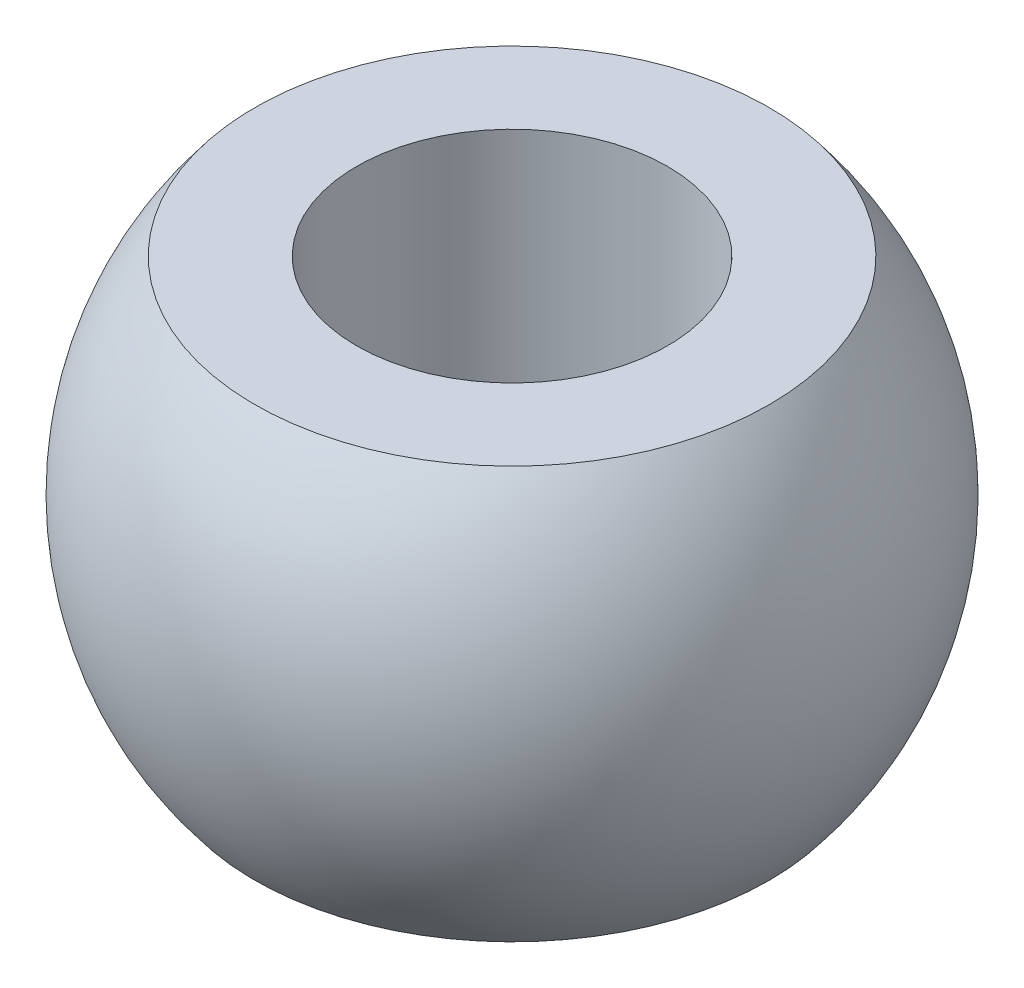
ISO-10303-21;
HEADER;
FILE_DESCRIPTION(('STEP AP214'),'2;1');
FILE_NAME('part.step','',(''),(''),'','','');
FILE_SCHEMA(('AUTOMOTIVE_DESIGN { 1 0 10303 214 1 1 1 1 }'));
ENDSEC;
DATA;
#1=APPLICATION_CONTEXT('core data for automotive mechanical design processes');
#2=APPLICATION_PROTOCOL_DEFINITION('international standard','automotive_design',2000,#1);
#3=PRODUCT_CONTEXT('',#1,'mechanical');
#4=PRODUCT('Part','Part','',(#3));
#5=PRODUCT_RELATED_PRODUCT_CATEGORY('part','',(#4));
#6=PRODUCT_DEFINITION_FORMATION('','',#4);
#7=PRODUCT_DEFINITION_CONTEXT('part definition',#1,'design');
#8=PRODUCT_DEFINITION('design','',#6,#7);
#9=PRODUCT_DEFINITION_SHAPE('','',#8);
#10=(LENGTH_UNIT() NAMED_UNIT(*) SI_UNIT(.MILLI.,.METRE.));
#11=(NAMED_UNIT(*) PLANE_ANGLE_UNIT() SI_UNIT($,.RADIAN.));
#12=(NAMED_UNIT(*) SI_UNIT($,.STERADIAN.) SOLID_ANGLE_UNIT());
#13=UNCERTAINTY_MEASURE_WITH_UNIT(LENGTH_MEASURE(1.E-05),#10,'distance_accuracy_value','');
#14=(GEOMETRIC_REPRESENTATION_CONTEXT(3) GLOBAL_UNCERTAINTY_ASSIGNED_CONTEXT((#13)) GLOBAL_UNIT_ASSIGNED_CONTEXT((#10,
#11,#12)) REPRESENTATION_CONTEXT('',''));
#15=CARTESIAN_POINT('',(0.,0.,0.));
#16=DIRECTION('',(0.,0.,1.));
#17=DIRECTION('',(1.,0.,0.));
#18=AXIS2_PLACEMENT_3D('',#15,#16,#17);
#19=CARTESIAN_POINT('',(5.,-6.625,0.));
#20=DIRECTION('',(0.,1.,0.));
#21=DIRECTION('',(0.,0.,1.));
#22=AXIS2_PLACEMENT_3D('',#19,#20,#21);
#23=PLANE('',#22);
#24=CARTESIAN_POINT('',(0.,-6.62500000000001,0.));
#25=DIRECTION('',(0.,1.,0.));
#26=DIRECTION('',(0.,0.,1.));
#27=AXIS2_PLACEMENT_3D('',#24,#25,#26);
#28=CIRCLE('',#27,8.27462234787788);
#29=CARTESIAN_POINT('',(8.27462234787788,-6.62500000000001,0.));
#30=VERTEX_POINT('',#29);
#31=EDGE_CURVE('E10',#30,#30,#28,.T.);
#32=ORIENTED_EDGE('',*,*,#31,.F.);
#33=EDGE_LOOP('',(#32));
#34=FACE_BOUND('',#33,.T.);
#35=CARTESIAN_POINT('',(0.,-6.625,0.));
#36=DIRECTION('',(0.,1.,0.));
#37=DIRECTION('',(0.,0.,1.));
#38=AXIS2_PLACEMENT_3D('',#35,#36,#37);
#39=CIRCLE('',#38,5.);
#40=CARTESIAN_POINT('',(0.,-6.625,5.));
#41=VERTEX_POINT('',#40);
#42=EDGE_CURVE('E46',#41,#41,#39,.T.);
#43=ORIENTED_EDGE('',*,*,#42,.T.);
#44=EDGE_LOOP('',(#43));
#45=FACE_BOUND('',#44,.T.);
#46=ADVANCED_FACE('F32',(#34,#45),#23,.F.);
#47=CARTESIAN_POINT('',(0.,0.,0.));
#48=DIRECTION('',(0.,1.,0.));
#49=DIRECTION('',(1.,0.,0.));
#50=AXIS2_PLACEMENT_3D('',#47,#48,#49);
#51=SPHERICAL_SURFACE('',#50,10.6);
#52=CARTESIAN_POINT('',(0.,6.625,0.));
#53=DIRECTION('',(0.,1.,0.));
#54=DIRECTION('',(0.,0.,1.));
#55=AXIS2_PLACEMENT_3D('',#52,#53,#54);
#56=CIRCLE('',#55,8.27462234787788);
#57=CARTESIAN_POINT('',(8.27462234787788,6.625,0.));
#58=VERTEX_POINT('',#57);
#59=EDGE_CURVE('E38',#58,#58,#56,.T.);
#60=CARTESIAN_POINT('',(8.27462234787788,6.625,0.));
#61=CARTESIAN_POINT('',(8.36780618467368,6.50861664026527,0.));
#62=CARTESIAN_POINT('',(8.45853138331952,6.39026498283566,0.));
#63=CARTESIAN_POINT('',(8.63491011465458,6.14984098782253,0.));
#64=CARTESIAN_POINT('',(8.7205636473438,6.02776865023899,0.));
#65=CARTESIAN_POINT('',(8.88664465710891,5.78011921015382,0.));
#66=CARTESIAN_POINT('',(8.9670721341848,5.65454210765217,0.));
#67=CARTESIAN_POINT('',(9.12255836578817,5.40010706699141,0.));
#68=CARTESIAN_POINT('',(9.19761712031565,5.27124912883229,0.));
#69=CARTESIAN_POINT('',(9.34223214913767,5.01048171115528,0.));
#70=CARTESIAN_POINT('',(9.41178842343221,4.87857223163741,0.));
#71=CARTESIAN_POINT('',(9.54527470339223,4.61193658536463,0.));
#72=CARTESIAN_POINT('',(9.60920470905771,4.47721041860973,0.));
#73=CARTESIAN_POINT('',(9.73132463278886,4.20518123214942,0.));
#74=CARTESIAN_POINT('',(9.78951455085454,4.06787821244402,0.));
#75=CARTESIAN_POINT('',(9.9000507114742,3.79093975086938,0.));
#76=CARTESIAN_POINT('',(9.95239695402819,3.65130430900014,0.));
#77=CARTESIAN_POINT('',(10.0511525753681,3.36994958364531,0.));
#78=CARTESIAN_POINT('',(10.0975619541541,3.22823030015973,0.));
#79=CARTESIAN_POINT('',(10.184361229489,2.94296018246203,0.));
#80=CARTESIAN_POINT('',(10.224751126038,2.79940934824991,0.));
#81=CARTESIAN_POINT('',(10.2994395341611,2.51073168036646,0.));
#82=CARTESIAN_POINT('',(10.3337380457351,2.36560484669513,0.));
#83=CARTESIAN_POINT('',(10.3961826252075,2.07403353682514,0.));
#84=CARTESIAN_POINT('',(10.4243286931058,1.92758906062647,0.));
#85=CARTESIAN_POINT('',(10.4744182791794,1.63364316830766,0.));
#86=CARTESIAN_POINT('',(10.4963617973547,1.4861417521875,0.));
#87=CARTESIAN_POINT('',(10.5340072198097,1.19034456421489,0.));
#88=CARTESIAN_POINT('',(10.5497091240895,1.04204879236243,0.));
#89=CARTESIAN_POINT('',(10.5748433659924,0.744926891237265,0.));
#90=CARTESIAN_POINT('',(10.5842757036156,0.596100761964553,0.));
#91=CARTESIAN_POINT('',(10.5968540206194,0.298183088461226,0.));
#92=CARTESIAN_POINT('',(10.6,0.149091544230611,0.));
#93=CARTESIAN_POINT('',(10.6,-0.149091544230618,0.));
#94=CARTESIAN_POINT('',(10.5968540206194,-0.298183088461233,0.));
#95=CARTESIAN_POINT('',(10.5842757036156,-0.59610076196456,0.));
#96=CARTESIAN_POINT('',(10.5748433659924,-0.744926891237273,0.));
#97=CARTESIAN_POINT('',(10.5497091240895,-1.04204879236244,0.));
#98=CARTESIAN_POINT('',(10.5340072198097,-1.19034456421489,0.));
#99=CARTESIAN_POINT('',(10.4963617973547,-1.48614175218751,0.));
#100=CARTESIAN_POINT('',(10.4744182791794,-1.63364316830766,0.));
#101=CARTESIAN_POINT('',(10.4243286931058,-1.92758906062648,0.));
#102=CARTESIAN_POINT('',(10.3961826252075,-2.07403353682514,0.));
#103=CARTESIAN_POINT('',(10.3337380457351,-2.36560484669513,0.));
#104=CARTESIAN_POINT('',(10.2994395341611,-2.51073168036646,0.));
#105=CARTESIAN_POINT('',(10.224751126038,-2.79940934824991,0.));
#106=CARTESIAN_POINT('',(10.184361229489,-2.94296018246203,0.));
#107=CARTESIAN_POINT('',(10.0975619541541,-3.22823030015974,0.));
#108=CARTESIAN_POINT('',(10.0511525753681,-3.36994958364532,0.));
#109=CARTESIAN_POINT('',(9.95239695402818,-3.65130430900015,0.));
#110=CARTESIAN_POINT('',(9.9000507114742,-3.79093975086939,0.));
#111=CARTESIAN_POINT('',(9.78951455085454,-4.06787821244403,0.));
#112=CARTESIAN_POINT('',(9.73132463278886,-4.20518123214943,0.));
#113=CARTESIAN_POINT('',(9.6092047090577,-4.47721041860973,0.));
#114=CARTESIAN_POINT('',(9.54527470339223,-4.61193658536463,0.));
#115=CARTESIAN_POINT('',(9.41178842343221,-4.87857223163741,0.));
#116=CARTESIAN_POINT('',(9.34223214913766,-5.01048171115529,0.));
#117=CARTESIAN_POINT('',(9.19761712031564,-5.27124912883229,0.));
#118=CARTESIAN_POINT('',(9.12255836578816,-5.40010706699141,0.));
#119=CARTESIAN_POINT('',(8.96707213418479,-5.65454210765218,0.));
#120=CARTESIAN_POINT('',(8.8866446571089,-5.78011921015382,0.));
#121=CARTESIAN_POINT('',(8.72056364734379,-6.027768650239,0.));
#122=CARTESIAN_POINT('',(8.63491011465458,-6.14984098782253,0.));
#123=CARTESIAN_POINT('',(8.45853138331952,-6.39026498283567,0.));
#124=CARTESIAN_POINT('',(8.36780618467368,-6.50861664026527,0.));
#125=CARTESIAN_POINT('',(8.27462234787788,-6.62500000000001,0.));
#126=B_SPLINE_CURVE_WITH_KNOTS('',3,(#60,#61,#62,#63,#64,#65,#66,#67,#68,#69,#70,#71,#72,#73,
#74,#75,#76,#77,#78,#79,#80,#81,#82,#83,#84,#85,#86,#87,#88,#89,#90,#91,#92,#93,#94,#95,#96,#97,
#98,#99,#100,#101,#102,#103,#104,#105,#106,#107,#108,#109,#110,#111,#112,#113,#114,#115,#116,
#117,#118,#119,#120,#121,#122,#123,#124,#125),.UNSPECIFIED.,.F.,.F.,(4,2,2,2,2,2,2,2,2,2,2,2,2,
2,2,2,2,2,2,2,2,2,2,2,2,2,2,2,2,2,2,2,4),(0.,0.447241459515948,0.894482919031895,
1.34172437854784,1.78896583806379,2.23620729757974,2.68344875709569,3.13069021661164,
3.57793167612758,4.02517313564353,4.47241459515948,4.91965605467543,5.36689751419137,
5.81413897370732,6.26138043322327,6.70862189273922,7.15586335225517,7.60310481177112,
8.05034627128706,8.49758773080301,8.94482919031896,9.3920706498349,9.83931210935085,
10.2865535688668,10.7337950283828,11.1810364878987,11.6282779474146,12.0755194069306,
12.5227608664465,12.9700023259625,13.4172437854784,13.8644852449944,14.3117267045103),.UNSPECIFIED.);
#127=EDGE_CURVE('BSEAM61',#58,#30,#126,.T.);
#128=ORIENTED_EDGE('',*,*,#59,.F.);
#129=ORIENTED_EDGE('',*,*,#31,.T.);
#130=ORIENTED_EDGE('',*,*,#127,.T.);
#131=ORIENTED_EDGE('',*,*,#127,.F.);
#132=EDGE_LOOP('',(#128,#130,#129,#131));
#133=FACE_BOUND('',#132,.T.);
#134=ADVANCED_FACE('F61',(#133),#51,.T.);
#135=CARTESIAN_POINT('',(5.,6.625,0.));
#136=DIRECTION('',(0.,-1.,0.));
#137=DIRECTION('',(0.,0.,-1.));
#138=AXIS2_PLACEMENT_3D('',#135,#136,#137);
#139=PLANE('',#138);
#140=CARTESIAN_POINT('',(0.,6.625,0.));
#141=DIRECTION('',(0.,1.,0.));
#142=DIRECTION('',(0.,0.,1.));
#143=AXIS2_PLACEMENT_3D('',#140,#141,#142);
#144=CIRCLE('',#143,5.);
#145=CARTESIAN_POINT('',(0.,6.625,5.));
#146=VERTEX_POINT('',#145);
#147=EDGE_CURVE('E42',#146,#146,#144,.T.);
#148=ORIENTED_EDGE('',*,*,#147,.F.);
#149=EDGE_LOOP('',(#148));
#150=FACE_BOUND('',#149,.T.);
#151=ORIENTED_EDGE('',*,*,#59,.T.);
#152=EDGE_LOOP('',(#151));
#153=FACE_BOUND('',#152,.T.);
#154=ADVANCED_FACE('F56',(#150,#153),#139,.F.);
#155=CARTESIAN_POINT('',(0.,6.625,0.));
#156=DIRECTION('',(0.,1.,0.));
#157=DIRECTION('',(0.,0.,1.));
#158=AXIS2_PLACEMENT_3D('',#155,#156,#157);
#159=CYLINDRICAL_SURFACE('',#158,5.);
#160=ORIENTED_EDGE('',*,*,#42,.F.);
#161=EDGE_LOOP('',(#160));
#162=FACE_BOUND('',#161,.T.);
#163=ORIENTED_EDGE('',*,*,#147,.T.);
#164=EDGE_LOOP('',(#163));
#165=FACE_BOUND('',#164,.T.);
#166=ADVANCED_FACE('F53',(#162,#165),#159,.F.);
#167=CLOSED_SHELL('',(#46,#134,#154,#166));
#168=MANIFOLD_SOLID_BREP('B2',#167);
#169=ADVANCED_BREP_SHAPE_REPRESENTATION('',(#18,#168),#14);
#170=SHAPE_DEFINITION_REPRESENTATION(#9,#169);
ENDSEC;
END-ISO-10303-21;
